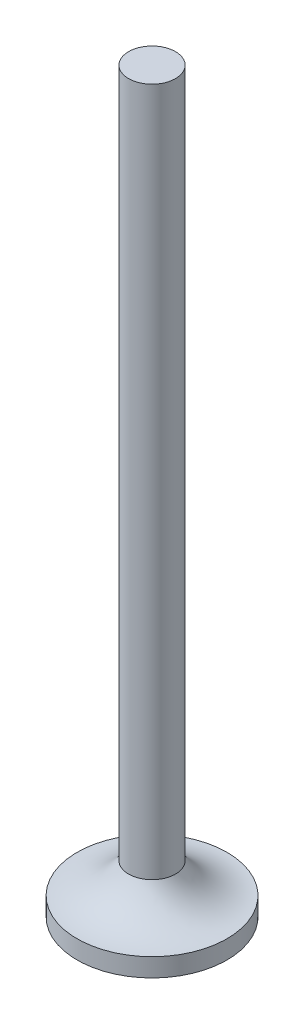
ISO-10303-21;
HEADER;
FILE_DESCRIPTION(('STEP AP214'),'2;1');
FILE_NAME('part.step','',(''),(''),'','','');
FILE_SCHEMA(('AUTOMOTIVE_DESIGN { 1 0 10303 214 1 1 1 1 }'));
ENDSEC;
DATA;
#1=APPLICATION_CONTEXT('core data for automotive mechanical design processes');
#2=APPLICATION_PROTOCOL_DEFINITION('international standard','automotive_design',2000,#1);
#3=PRODUCT_CONTEXT('',#1,'mechanical');
#4=PRODUCT('Part','Part','',(#3));
#5=PRODUCT_RELATED_PRODUCT_CATEGORY('part','',(#4));
#6=PRODUCT_DEFINITION_FORMATION('','',#4);
#7=PRODUCT_DEFINITION_CONTEXT('part definition',#1,'design');
#8=PRODUCT_DEFINITION('design','',#6,#7);
#9=PRODUCT_DEFINITION_SHAPE('','',#8);
#10=(LENGTH_UNIT() NAMED_UNIT(*) SI_UNIT(.MILLI.,.METRE.));
#11=(NAMED_UNIT(*) PLANE_ANGLE_UNIT() SI_UNIT($,.RADIAN.));
#12=(NAMED_UNIT(*) SI_UNIT($,.STERADIAN.) SOLID_ANGLE_UNIT());
#13=UNCERTAINTY_MEASURE_WITH_UNIT(LENGTH_MEASURE(1.E-05),#10,'distance_accuracy_value','');
#14=(GEOMETRIC_REPRESENTATION_CONTEXT(3) GLOBAL_UNCERTAINTY_ASSIGNED_CONTEXT((#13)) GLOBAL_UNIT_ASSIGNED_CONTEXT((#10,
#11,#12)) REPRESENTATION_CONTEXT('',''));
#15=CARTESIAN_POINT('',(0.,0.,0.));
#16=DIRECTION('',(0.,0.,1.));
#17=DIRECTION('',(1.,0.,0.));
#18=AXIS2_PLACEMENT_3D('',#15,#16,#17);
#19=CARTESIAN_POINT('',(3.175,100.,0.));
#20=DIRECTION('',(0.,1.,0.));
#21=DIRECTION('',(0.,0.,1.));
#22=AXIS2_PLACEMENT_3D('',#19,#20,#21);
#23=PLANE('',#22);
#24=CARTESIAN_POINT('',(0.,100.,0.));
#25=DIRECTION('',(0.,-1.,0.));
#26=DIRECTION('',(0.,0.,-1.));
#27=AXIS2_PLACEMENT_3D('',#24,#25,#26);
#28=CIRCLE('',#27,3.175);
#29=CARTESIAN_POINT('',(0.,100.,-3.175));
#30=VERTEX_POINT('',#29);
#31=EDGE_CURVE('E10',#30,#30,#28,.T.);
#32=ORIENTED_EDGE('',*,*,#31,.F.);
#33=EDGE_LOOP('',(#32));
#34=FACE_BOUND('',#33,.T.);
#35=ADVANCED_FACE('F34',(#34),#23,.T.);
#36=CARTESIAN_POINT('',(0.,-31.8317037555853,0.));
#37=DIRECTION('',(0.,-1.,0.));
#38=DIRECTION('',(0.,0.,-1.));
#39=AXIS2_PLACEMENT_3D('',#36,#37,#38);
#40=CYLINDRICAL_SURFACE('',#39,3.175);
#41=ORIENTED_EDGE('',*,*,#31,.T.);
#42=EDGE_LOOP('',(#41));
#43=FACE_BOUND('',#42,.T.);
#44=CARTESIAN_POINT('',(0.,6.60002884626052,0.));
#45=DIRECTION('',(0.,-1.,0.));
#46=DIRECTION('',(0.,0.,-1.));
#47=AXIS2_PLACEMENT_3D('',#44,#45,#46);
#48=CIRCLE('',#47,3.175);
#49=CARTESIAN_POINT('',(0.,6.60002884626052,-3.175));
#50=VERTEX_POINT('',#49);
#51=EDGE_CURVE('E40',#50,#50,#48,.T.);
#52=ORIENTED_EDGE('',*,*,#51,.F.);
#53=EDGE_LOOP('',(#52));
#54=FACE_BOUND('',#53,.T.);
#55=ADVANCED_FACE('F66',(#43,#54),#40,.T.);
#56=CARTESIAN_POINT('',(0.,10.5,0.));
#57=DIRECTION('',(0.,-1.,0.));
#58=DIRECTION('',(0.,0.,-1.));
#59=AXIS2_PLACEMENT_3D('',#56,#57,#58);
#60=TOROIDAL_SURFACE('',#59,10.16,8.);
#61=ORIENTED_EDGE('',*,*,#51,.T.);
#62=EDGE_LOOP('',(#61));
#63=FACE_BOUND('',#62,.T.);
#64=CARTESIAN_POINT('',(0.,2.5,0.));
#65=DIRECTION('',(0.,-1.,0.));
#66=DIRECTION('',(0.,0.,-1.));
#67=AXIS2_PLACEMENT_3D('',#64,#65,#66);
#68=CIRCLE('',#67,10.16);
#69=CARTESIAN_POINT('',(0.,2.5,-10.16));
#70=VERTEX_POINT('',#69);
#71=EDGE_CURVE('E44',#70,#70,#68,.T.);
#72=ORIENTED_EDGE('',*,*,#71,.F.);
#73=EDGE_LOOP('',(#72));
#74=FACE_BOUND('',#73,.T.);
#75=ADVANCED_FACE('F58',(#63,#74),#60,.F.);
#76=CARTESIAN_POINT('',(0.,-31.8317037555853,0.));
#77=DIRECTION('',(0.,-1.,0.));
#78=DIRECTION('',(0.,0.,-1.));
#79=AXIS2_PLACEMENT_3D('',#76,#77,#78);
#80=CYLINDRICAL_SURFACE('',#79,10.16);
#81=ORIENTED_EDGE('',*,*,#71,.T.);
#82=EDGE_LOOP('',(#81));
#83=FACE_BOUND('',#82,.T.);
#84=CARTESIAN_POINT('',(0.,0.,0.));
#85=DIRECTION('',(0.,-1.,0.));
#86=DIRECTION('',(0.,0.,-1.));
#87=AXIS2_PLACEMENT_3D('',#84,#85,#86);
#88=CIRCLE('',#87,10.16);
#89=CARTESIAN_POINT('',(0.,0.,-10.16));
#90=VERTEX_POINT('',#89);
#91=EDGE_CURVE('E48',#90,#90,#88,.T.);
#92=ORIENTED_EDGE('',*,*,#91,.F.);
#93=EDGE_LOOP('',(#92));
#94=FACE_BOUND('',#93,.T.);
#95=ADVANCED_FACE('F56',(#83,#94),#80,.T.);
#96=CARTESIAN_POINT('',(0.,0.,0.));
#97=DIRECTION('',(0.,-1.,0.));
#98=DIRECTION('',(0.,0.,-1.));
#99=AXIS2_PLACEMENT_3D('',#96,#97,#98);
#100=PLANE('',#99);
#101=ORIENTED_EDGE('',*,*,#91,.T.);
#102=EDGE_LOOP('',(#101));
#103=FACE_BOUND('',#102,.T.);
#104=ADVANCED_FACE('F54',(#103),#100,.T.);
#105=CLOSED_SHELL('',(#35,#55,#75,#95,#104));
#106=MANIFOLD_SOLID_BREP('B2',#105);
#107=ADVANCED_BREP_SHAPE_REPRESENTATION('',(#18,#106),#14);
#108=SHAPE_DEFINITION_REPRESENTATION(#9,#107);
ENDSEC;
END-ISO-10303-21;
